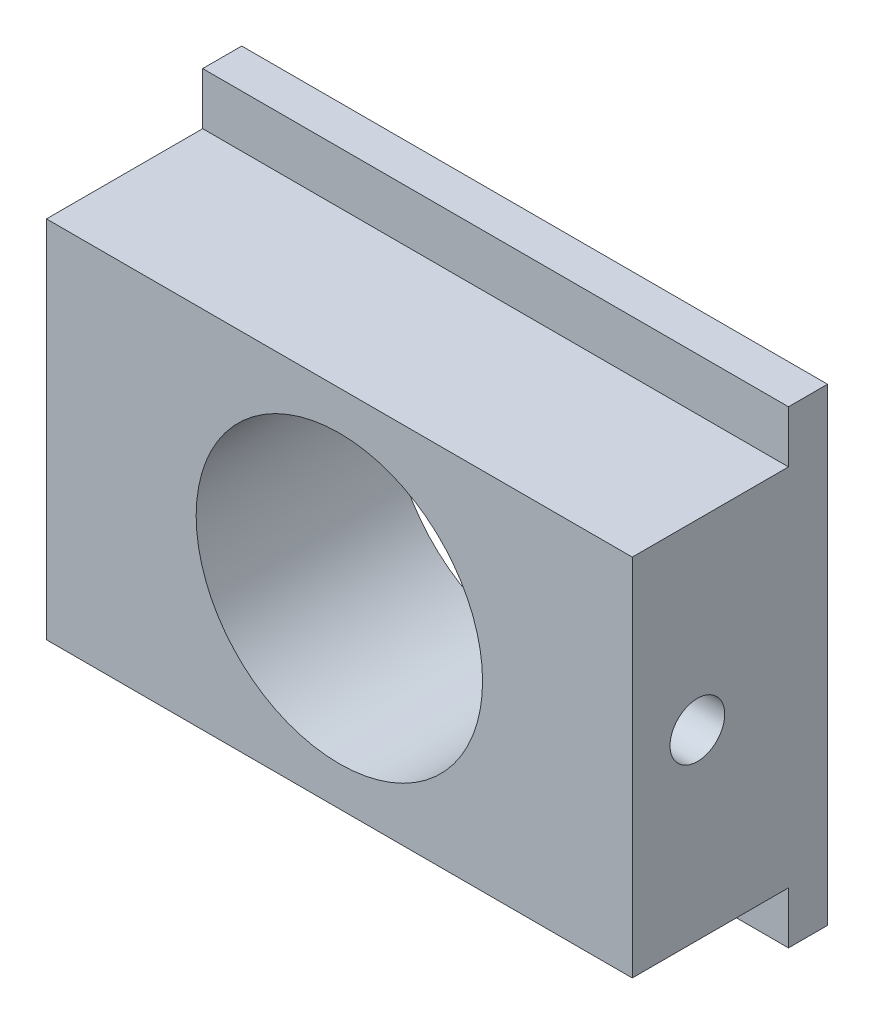
ISO-10303-21;
HEADER;
FILE_DESCRIPTION(('STEP AP214'),'2;1');
FILE_NAME('part.step','',(''),(''),'','','');
FILE_SCHEMA(('AUTOMOTIVE_DESIGN { 1 0 10303 214 1 1 1 1 }'));
ENDSEC;
DATA;
#1=APPLICATION_CONTEXT('core data for automotive mechanical design processes');
#2=APPLICATION_PROTOCOL_DEFINITION('international standard','automotive_design',2000,#1);
#3=PRODUCT_CONTEXT('',#1,'mechanical');
#4=PRODUCT('Part','Part','',(#3));
#5=PRODUCT_RELATED_PRODUCT_CATEGORY('part','',(#4));
#6=PRODUCT_DEFINITION_FORMATION('','',#4);
#7=PRODUCT_DEFINITION_CONTEXT('part definition',#1,'design');
#8=PRODUCT_DEFINITION('design','',#6,#7);
#9=PRODUCT_DEFINITION_SHAPE('','',#8);
#10=(LENGTH_UNIT() NAMED_UNIT(*) SI_UNIT(.MILLI.,.METRE.));
#11=(NAMED_UNIT(*) PLANE_ANGLE_UNIT() SI_UNIT($,.RADIAN.));
#12=(NAMED_UNIT(*) SI_UNIT($,.STERADIAN.) SOLID_ANGLE_UNIT());
#13=UNCERTAINTY_MEASURE_WITH_UNIT(LENGTH_MEASURE(1.E-05),#10,'distance_accuracy_value','');
#14=(GEOMETRIC_REPRESENTATION_CONTEXT(3) GLOBAL_UNCERTAINTY_ASSIGNED_CONTEXT((#13)) GLOBAL_UNIT_ASSIGNED_CONTEXT((#10,
#11,#12)) REPRESENTATION_CONTEXT('',''));
#15=CARTESIAN_POINT('',(0.,0.,0.));
#16=DIRECTION('',(0.,0.,1.));
#17=DIRECTION('',(1.,0.,0.));
#18=AXIS2_PLACEMENT_3D('',#15,#16,#17);
#19=CARTESIAN_POINT('',(0.,0.,20.));
#20=DIRECTION('',(1.,0.,0.));
#21=DIRECTION('',(0.,0.,-1.));
#22=AXIS2_PLACEMENT_3D('',#19,#20,#21);
#23=PLANE('',#22);
#24=DIRECTION('',(0.,1.,0.));
#25=VECTOR('',#24,1.);
#26=CARTESIAN_POINT('',(0.,0.,5.));
#27=LINE('',#26,#25);
#28=CARTESIAN_POINT('',(0.,-4.,5.));
#29=VERTEX_POINT('',#28);
#30=CARTESIAN_POINT('',(0.,32.,5.));
#31=VERTEX_POINT('',#30);
#32=EDGE_CURVE('E178',#29,#31,#27,.T.);
#33=ORIENTED_EDGE('',*,*,#32,.F.);
#34=DIRECTION('',(0.,0.,-1.));
#35=VECTOR('',#34,1.);
#36=CARTESIAN_POINT('',(0.,-4.,8.));
#37=LINE('',#36,#35);
#38=CARTESIAN_POINT('',(0.,-4.,8.));
#39=VERTEX_POINT('',#38);
#40=EDGE_CURVE('E120',#39,#29,#37,.T.);
#41=ORIENTED_EDGE('',*,*,#40,.F.);
#42=DIRECTION('',(0.,1.,0.));
#43=VECTOR('',#42,1.);
#44=CARTESIAN_POINT('',(0.,0.,8.));
#45=LINE('',#44,#43);
#46=CARTESIAN_POINT('',(0.,0.,8.));
#47=VERTEX_POINT('',#46);
#48=EDGE_CURVE('E110',#39,#47,#45,.T.);
#49=ORIENTED_EDGE('',*,*,#48,.T.);
#50=DIRECTION('',(0.,0.,-1.));
#51=VECTOR('',#50,1.);
#52=CARTESIAN_POINT('',(0.,0.,20.));
#53=LINE('',#52,#51);
#54=CARTESIAN_POINT('',(0.,0.,20.));
#55=VERTEX_POINT('',#54);
#56=EDGE_CURVE('E11',#55,#47,#53,.T.);
#57=ORIENTED_EDGE('',*,*,#56,.F.);
#58=DIRECTION('',(0.,-1.,0.));
#59=VECTOR('',#58,1.);
#60=CARTESIAN_POINT('',(0.,0.,20.));
#61=LINE('',#60,#59);
#62=CARTESIAN_POINT('',(0.,28.,20.));
#63=VERTEX_POINT('',#62);
#64=EDGE_CURVE('E129',#63,#55,#61,.T.);
#65=ORIENTED_EDGE('',*,*,#64,.F.);
#66=DIRECTION('',(0.,0.,-1.));
#67=VECTOR('',#66,1.);
#68=CARTESIAN_POINT('',(0.,28.,20.));
#69=LINE('',#68,#67);
#70=CARTESIAN_POINT('',(0.,28.,8.));
#71=VERTEX_POINT('',#70);
#72=EDGE_CURVE('E146',#63,#71,#69,.T.);
#73=ORIENTED_EDGE('',*,*,#72,.T.);
#74=DIRECTION('',(0.,1.,0.));
#75=VECTOR('',#74,1.);
#76=CARTESIAN_POINT('',(0.,28.,8.));
#77=LINE('',#76,#75);
#78=CARTESIAN_POINT('',(0.,32.,8.));
#79=VERTEX_POINT('',#78);
#80=EDGE_CURVE('E62',#71,#79,#77,.T.);
#81=ORIENTED_EDGE('',*,*,#80,.T.);
#82=DIRECTION('',(0.,0.,-1.));
#83=VECTOR('',#82,1.);
#84=CARTESIAN_POINT('',(0.,32.,8.));
#85=LINE('',#84,#83);
#86=EDGE_CURVE('E162',#79,#31,#85,.T.);
#87=ORIENTED_EDGE('',*,*,#86,.T.);
#88=EDGE_LOOP('',(#33,#41,#49,#57,#65,#73,#81,#87));
#89=FACE_BOUND('',#88,.T.);
#90=ADVANCED_FACE('F39',(#89),#23,.F.);
#91=CARTESIAN_POINT('',(0.,0.,20.));
#92=DIRECTION('',(0.,1.,0.));
#93=DIRECTION('',(0.,0.,1.));
#94=AXIS2_PLACEMENT_3D('',#91,#92,#93);
#95=PLANE('',#94);
#96=ORIENTED_EDGE('',*,*,#56,.T.);
#97=DIRECTION('',(1.,0.,0.));
#98=VECTOR('',#97,1.);
#99=CARTESIAN_POINT('',(0.,0.,8.));
#100=LINE('',#99,#98);
#101=CARTESIAN_POINT('',(45.,0.,8.));
#102=VERTEX_POINT('',#101);
#103=EDGE_CURVE('E107',#47,#102,#100,.T.);
#104=ORIENTED_EDGE('',*,*,#103,.T.);
#105=DIRECTION('',(0.,0.,-1.));
#106=VECTOR('',#105,1.);
#107=CARTESIAN_POINT('',(45.,0.,20.));
#108=LINE('',#107,#106);
#109=CARTESIAN_POINT('',(45.,0.,20.));
#110=VERTEX_POINT('',#109);
#111=EDGE_CURVE('E47',#110,#102,#108,.T.);
#112=ORIENTED_EDGE('',*,*,#111,.F.);
#113=DIRECTION('',(1.,0.,0.));
#114=VECTOR('',#113,1.);
#115=CARTESIAN_POINT('',(0.,0.,20.));
#116=LINE('',#115,#114);
#117=EDGE_CURVE('E124',#55,#110,#116,.T.);
#118=ORIENTED_EDGE('',*,*,#117,.F.);
#119=EDGE_LOOP('',(#96,#104,#112,#118));
#120=FACE_BOUND('',#119,.T.);
#121=ADVANCED_FACE('F123',(#120),#95,.F.);
#122=CARTESIAN_POINT('',(45.,0.,20.));
#123=DIRECTION('',(-1.,0.,0.));
#124=DIRECTION('',(0.,0.,1.));
#125=AXIS2_PLACEMENT_3D('',#122,#123,#124);
#126=PLANE('',#125);
#127=CARTESIAN_POINT('',(45.,14.,15.));
#128=DIRECTION('',(1.,0.,0.));
#129=DIRECTION('',(0.,0.,-1.));
#130=AXIS2_PLACEMENT_3D('',#127,#128,#129);
#131=CIRCLE('',#130,2.09999999999999);
#132=CARTESIAN_POINT('',(45.,14.,12.9));
#133=VERTEX_POINT('',#132);
#134=EDGE_CURVE('E183',#133,#133,#131,.T.);
#135=ORIENTED_EDGE('',*,*,#134,.F.);
#136=EDGE_LOOP('',(#135));
#137=FACE_BOUND('',#136,.T.);
#138=DIRECTION('',(0.,-1.,0.));
#139=VECTOR('',#138,1.);
#140=CARTESIAN_POINT('',(45.,0.,5.));
#141=LINE('',#140,#139);
#142=CARTESIAN_POINT('',(45.,32.,5.));
#143=VERTEX_POINT('',#142);
#144=CARTESIAN_POINT('',(45.,-4.00000000000001,5.));
#145=VERTEX_POINT('',#144);
#146=EDGE_CURVE('E181',#143,#145,#141,.T.);
#147=ORIENTED_EDGE('',*,*,#146,.F.);
#148=DIRECTION('',(0.,0.,-1.));
#149=VECTOR('',#148,1.);
#150=CARTESIAN_POINT('',(45.,32.,8.));
#151=LINE('',#150,#149);
#152=CARTESIAN_POINT('',(45.,32.,8.));
#153=VERTEX_POINT('',#152);
#154=EDGE_CURVE('E171',#153,#143,#151,.T.);
#155=ORIENTED_EDGE('',*,*,#154,.F.);
#156=DIRECTION('',(0.,-1.,0.));
#157=VECTOR('',#156,1.);
#158=CARTESIAN_POINT('',(45.,28.,8.));
#159=LINE('',#158,#157);
#160=CARTESIAN_POINT('',(45.,28.,8.));
#161=VERTEX_POINT('',#160);
#162=EDGE_CURVE('E157',#153,#161,#159,.T.);
#163=ORIENTED_EDGE('',*,*,#162,.T.);
#164=DIRECTION('',(0.,0.,-1.));
#165=VECTOR('',#164,1.);
#166=CARTESIAN_POINT('',(45.,28.,20.));
#167=LINE('',#166,#165);
#168=CARTESIAN_POINT('',(45.,28.,20.));
#169=VERTEX_POINT('',#168);
#170=EDGE_CURVE('E148',#169,#161,#167,.T.);
#171=ORIENTED_EDGE('',*,*,#170,.F.);
#172=DIRECTION('',(0.,1.,0.));
#173=VECTOR('',#172,1.);
#174=CARTESIAN_POINT('',(45.,0.,20.));
#175=LINE('',#174,#173);
#176=EDGE_CURVE('E128',#110,#169,#175,.T.);
#177=ORIENTED_EDGE('',*,*,#176,.F.);
#178=ORIENTED_EDGE('',*,*,#111,.T.);
#179=DIRECTION('',(0.,-1.,0.));
#180=VECTOR('',#179,1.);
#181=CARTESIAN_POINT('',(45.,0.,8.));
#182=LINE('',#181,#180);
#183=CARTESIAN_POINT('',(45.,-4.00000000000001,8.));
#184=VERTEX_POINT('',#183);
#185=EDGE_CURVE('E54',#102,#184,#182,.T.);
#186=ORIENTED_EDGE('',*,*,#185,.T.);
#187=DIRECTION('',(0.,0.,-1.));
#188=VECTOR('',#187,1.);
#189=CARTESIAN_POINT('',(45.,-4.00000000000001,8.));
#190=LINE('',#189,#188);
#191=EDGE_CURVE('E316',#184,#145,#190,.T.);
#192=ORIENTED_EDGE('',*,*,#191,.T.);
#193=EDGE_LOOP('',(#147,#155,#163,#171,#177,#178,#186,#192));
#194=FACE_BOUND('',#193,.T.);
#195=ADVANCED_FACE('F152',(#137,#194),#126,.F.);
#196=CARTESIAN_POINT('',(0.,28.,20.));
#197=DIRECTION('',(0.,-1.,0.));
#198=DIRECTION('',(0.,0.,-1.));
#199=AXIS2_PLACEMENT_3D('',#196,#197,#198);
#200=PLANE('',#199);
#201=ORIENTED_EDGE('',*,*,#170,.T.);
#202=DIRECTION('',(-1.,0.,0.));
#203=VECTOR('',#202,1.);
#204=CARTESIAN_POINT('',(45.,28.,8.));
#205=LINE('',#204,#203);
#206=EDGE_CURVE('E160',#161,#71,#205,.T.);
#207=ORIENTED_EDGE('',*,*,#206,.T.);
#208=ORIENTED_EDGE('',*,*,#72,.F.);
#209=DIRECTION('',(-1.,0.,0.));
#210=VECTOR('',#209,1.);
#211=CARTESIAN_POINT('',(0.,28.,20.));
#212=LINE('',#211,#210);
#213=EDGE_CURVE('E134',#169,#63,#212,.T.);
#214=ORIENTED_EDGE('',*,*,#213,.F.);
#215=EDGE_LOOP('',(#201,#207,#208,#214));
#216=FACE_BOUND('',#215,.T.);
#217=ADVANCED_FACE('F159',(#216),#200,.F.);
#218=CARTESIAN_POINT('',(22.5,14.,20.));
#219=DIRECTION('',(0.,0.,-1.));
#220=DIRECTION('',(-1.,0.,0.));
#221=AXIS2_PLACEMENT_3D('',#218,#219,#220);
#222=CYLINDRICAL_SURFACE('',#221,11.);
#223=CARTESIAN_POINT('',(22.5,14.,20.));
#224=DIRECTION('',(0.,0.,1.));
#225=DIRECTION('',(1.,0.,0.));
#226=AXIS2_PLACEMENT_3D('',#223,#224,#225);
#227=CIRCLE('',#226,11.);
#228=CARTESIAN_POINT('',(33.5,14.,20.));
#229=VERTEX_POINT('',#228);
#230=EDGE_CURVE('E137',#229,#229,#227,.T.);
#231=ORIENTED_EDGE('',*,*,#230,.T.);
#232=EDGE_LOOP('',(#231));
#233=FACE_BOUND('',#232,.T.);
#234=CARTESIAN_POINT('',(22.5,14.,5.));
#235=DIRECTION('',(0.,0.,-1.));
#236=DIRECTION('',(-1.,0.,0.));
#237=AXIS2_PLACEMENT_3D('',#234,#235,#236);
#238=CIRCLE('',#237,11.);
#239=CARTESIAN_POINT('',(11.5,14.,5.));
#240=VERTEX_POINT('',#239);
#241=EDGE_CURVE('E42',#240,#240,#238,.T.);
#242=ORIENTED_EDGE('',*,*,#241,.T.);
#243=EDGE_LOOP('',(#242));
#244=FACE_BOUND('',#243,.T.);
#245=ADVANCED_FACE('F203',(#233,#244),#222,.F.);
#246=CARTESIAN_POINT('',(0.,0.,20.));
#247=DIRECTION('',(0.,0.,-1.));
#248=DIRECTION('',(-1.,0.,0.));
#249=AXIS2_PLACEMENT_3D('',#246,#247,#248);
#250=PLANE('',#249);
#251=ORIENTED_EDGE('',*,*,#64,.T.);
#252=ORIENTED_EDGE('',*,*,#117,.T.);
#253=ORIENTED_EDGE('',*,*,#176,.T.);
#254=ORIENTED_EDGE('',*,*,#213,.T.);
#255=EDGE_LOOP('',(#251,#252,#253,#254));
#256=FACE_BOUND('',#255,.T.);
#257=ORIENTED_EDGE('',*,*,#230,.F.);
#258=EDGE_LOOP('',(#257));
#259=FACE_BOUND('',#258,.T.);
#260=ADVANCED_FACE('F131',(#256,#259),#250,.F.);
#261=CARTESIAN_POINT('',(37.,14.,15.));
#262=DIRECTION('',(1.,0.,0.));
#263=DIRECTION('',(0.,0.,-1.));
#264=AXIS2_PLACEMENT_3D('',#261,#262,#263);
#265=CONICAL_SURFACE('',#264,2.1,1.02974425867665);
#266=CARTESIAN_POINT('',(35.7381927000421,14.,15.));
#267=VERTEX_POINT('',#266);
#268=VERTEX_LOOP('',#267);
#269=FACE_BOUND('',#268,.T.);
#270=CARTESIAN_POINT('',(37.,14.,15.));
#271=DIRECTION('',(1.,0.,0.));
#272=DIRECTION('',(0.,0.,-1.));
#273=AXIS2_PLACEMENT_3D('',#270,#271,#272);
#274=CIRCLE('',#273,2.1);
#275=CARTESIAN_POINT('',(37.,14.,12.9));
#276=VERTEX_POINT('',#275);
#277=EDGE_CURVE('E140',#276,#276,#274,.T.);
#278=ORIENTED_EDGE('',*,*,#277,.T.);
#279=EDGE_LOOP('',(#278));
#280=FACE_BOUND('',#279,.T.);
#281=ADVANCED_FACE('F188',(#269,#280),#265,.F.);
#282=CARTESIAN_POINT('',(45.,14.,15.));
#283=DIRECTION('',(1.,0.,0.));
#284=DIRECTION('',(0.,0.,-1.));
#285=AXIS2_PLACEMENT_3D('',#282,#283,#284);
#286=CYLINDRICAL_SURFACE('',#285,2.09999999999999);
#287=ORIENTED_EDGE('',*,*,#277,.F.);
#288=EDGE_LOOP('',(#287));
#289=FACE_BOUND('',#288,.T.);
#290=ORIENTED_EDGE('',*,*,#134,.T.);
#291=EDGE_LOOP('',(#290));
#292=FACE_BOUND('',#291,.T.);
#293=ADVANCED_FACE('F190',(#289,#292),#286,.F.);
#294=CARTESIAN_POINT('',(0.,0.,5.));
#295=DIRECTION('',(0.,0.,-1.));
#296=DIRECTION('',(-1.,0.,0.));
#297=AXIS2_PLACEMENT_3D('',#294,#295,#296);
#298=PLANE('',#297);
#299=ORIENTED_EDGE('',*,*,#241,.F.);
#300=EDGE_LOOP('',(#299));
#301=FACE_BOUND('',#300,.T.);
#302=ORIENTED_EDGE('',*,*,#32,.T.);
#303=DIRECTION('',(1.,0.,0.));
#304=VECTOR('',#303,1.);
#305=CARTESIAN_POINT('',(45.,32.,5.));
#306=LINE('',#305,#304);
#307=EDGE_CURVE('E175',#31,#143,#306,.T.);
#308=ORIENTED_EDGE('',*,*,#307,.T.);
#309=ORIENTED_EDGE('',*,*,#146,.T.);
#310=DIRECTION('',(-1.,0.,0.));
#311=VECTOR('',#310,1.);
#312=CARTESIAN_POINT('',(0.,-4.,5.));
#313=LINE('',#312,#311);
#314=EDGE_CURVE('E121',#145,#29,#313,.T.);
#315=ORIENTED_EDGE('',*,*,#314,.T.);
#316=EDGE_LOOP('',(#302,#308,#309,#315));
#317=FACE_BOUND('',#316,.T.);
#318=ADVANCED_FACE('F193',(#301,#317),#298,.T.);
#319=CARTESIAN_POINT('',(45.,32.,8.));
#320=DIRECTION('',(0.,1.,0.));
#321=DIRECTION('',(0.,0.,1.));
#322=AXIS2_PLACEMENT_3D('',#319,#320,#321);
#323=PLANE('',#322);
#324=ORIENTED_EDGE('',*,*,#307,.F.);
#325=ORIENTED_EDGE('',*,*,#86,.F.);
#326=DIRECTION('',(1.,0.,0.));
#327=VECTOR('',#326,1.);
#328=CARTESIAN_POINT('',(45.,32.,8.));
#329=LINE('',#328,#327);
#330=EDGE_CURVE('E164',#79,#153,#329,.T.);
#331=ORIENTED_EDGE('',*,*,#330,.T.);
#332=ORIENTED_EDGE('',*,*,#154,.T.);
#333=EDGE_LOOP('',(#324,#325,#331,#332));
#334=FACE_BOUND('',#333,.T.);
#335=ADVANCED_FACE('F238',(#334),#323,.T.);
#336=CARTESIAN_POINT('',(0.,0.,8.));
#337=DIRECTION('',(0.,0.,1.));
#338=DIRECTION('',(1.,0.,0.));
#339=AXIS2_PLACEMENT_3D('',#336,#337,#338);
#340=PLANE('',#339);
#341=ORIENTED_EDGE('',*,*,#162,.F.);
#342=ORIENTED_EDGE('',*,*,#330,.F.);
#343=ORIENTED_EDGE('',*,*,#80,.F.);
#344=ORIENTED_EDGE('',*,*,#206,.F.);
#345=EDGE_LOOP('',(#341,#342,#343,#344));
#346=FACE_BOUND('',#345,.T.);
#347=ADVANCED_FACE('F167',(#346),#340,.T.);
#348=CARTESIAN_POINT('',(0.,-4.,8.));
#349=DIRECTION('',(0.,-1.,0.));
#350=DIRECTION('',(1.,0.,0.));
#351=AXIS2_PLACEMENT_3D('',#348,#349,#350);
#352=PLANE('',#351);
#353=ORIENTED_EDGE('',*,*,#314,.F.);
#354=ORIENTED_EDGE('',*,*,#191,.F.);
#355=DIRECTION('',(-1.,0.,0.));
#356=VECTOR('',#355,1.);
#357=CARTESIAN_POINT('',(0.,-4.,8.));
#358=LINE('',#357,#356);
#359=EDGE_CURVE('E315',#184,#39,#358,.T.);
#360=ORIENTED_EDGE('',*,*,#359,.T.);
#361=ORIENTED_EDGE('',*,*,#40,.T.);
#362=EDGE_LOOP('',(#353,#354,#360,#361));
#363=FACE_BOUND('',#362,.T.);
#364=ADVANCED_FACE('F256',(#363),#352,.T.);
#365=CARTESIAN_POINT('',(0.,0.,8.));
#366=DIRECTION('',(0.,0.,1.));
#367=DIRECTION('',(1.,0.,0.));
#368=AXIS2_PLACEMENT_3D('',#365,#366,#367);
#369=PLANE('',#368);
#370=ORIENTED_EDGE('',*,*,#48,.F.);
#371=ORIENTED_EDGE('',*,*,#359,.F.);
#372=ORIENTED_EDGE('',*,*,#185,.F.);
#373=ORIENTED_EDGE('',*,*,#103,.F.);
#374=EDGE_LOOP('',(#370,#371,#372,#373));
#375=FACE_BOUND('',#374,.T.);
#376=ADVANCED_FACE('F109',(#375),#369,.T.);
#377=CLOSED_SHELL('',(#90,#121,#195,#217,#245,#260,#281,#293,#318,#335,#347,#364,#376));
#378=MANIFOLD_SOLID_BREP('B2',#377);
#379=ADVANCED_BREP_SHAPE_REPRESENTATION('',(#18,#378),#14);
#380=SHAPE_DEFINITION_REPRESENTATION(#9,#379);
ENDSEC;
END-ISO-10303-21;
